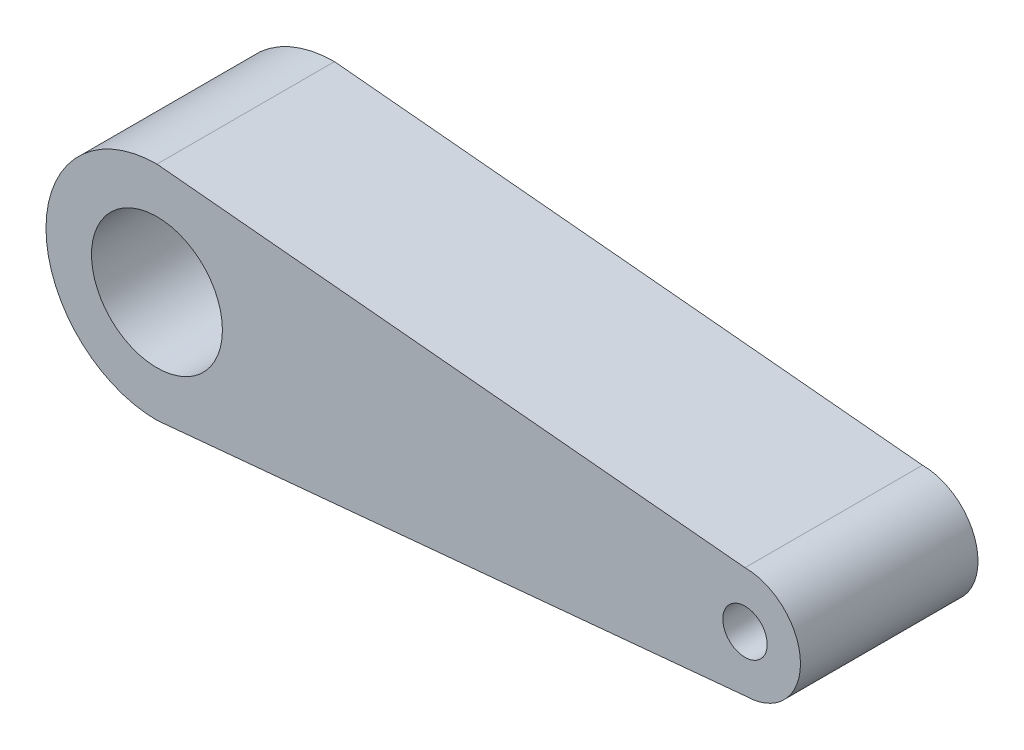
ISO-10303-21;
HEADER;
FILE_DESCRIPTION(('STEP AP214'),'2;1');
FILE_NAME('part.step','',(''),(''),'','','');
FILE_SCHEMA(('AUTOMOTIVE_DESIGN { 1 0 10303 214 1 1 1 1 }'));
ENDSEC;
DATA;
#1=APPLICATION_CONTEXT('core data for automotive mechanical design processes');
#2=APPLICATION_PROTOCOL_DEFINITION('international standard','automotive_design',2000,#1);
#3=PRODUCT_CONTEXT('',#1,'mechanical');
#4=PRODUCT('Part','Part','',(#3));
#5=PRODUCT_RELATED_PRODUCT_CATEGORY('part','',(#4));
#6=PRODUCT_DEFINITION_FORMATION('','',#4);
#7=PRODUCT_DEFINITION_CONTEXT('part definition',#1,'design');
#8=PRODUCT_DEFINITION('design','',#6,#7);
#9=PRODUCT_DEFINITION_SHAPE('','',#8);
#10=(LENGTH_UNIT() NAMED_UNIT(*) SI_UNIT(.MILLI.,.METRE.));
#11=(NAMED_UNIT(*) PLANE_ANGLE_UNIT() SI_UNIT($,.RADIAN.));
#12=(NAMED_UNIT(*) SI_UNIT($,.STERADIAN.) SOLID_ANGLE_UNIT());
#13=UNCERTAINTY_MEASURE_WITH_UNIT(LENGTH_MEASURE(1.E-05),#10,'distance_accuracy_value','');
#14=(GEOMETRIC_REPRESENTATION_CONTEXT(3) GLOBAL_UNCERTAINTY_ASSIGNED_CONTEXT((#13)) GLOBAL_UNIT_ASSIGNED_CONTEXT((#10,
#11,#12)) REPRESENTATION_CONTEXT('',''));
#15=CARTESIAN_POINT('',(0.,0.,0.));
#16=DIRECTION('',(0.,0.,1.));
#17=DIRECTION('',(1.,0.,0.));
#18=AXIS2_PLACEMENT_3D('',#15,#16,#17);
#19=CARTESIAN_POINT('',(26.5,0.,8.));
#20=DIRECTION('',(0.,0.,-1.));
#21=DIRECTION('',(-1.,0.,0.));
#22=AXIS2_PLACEMENT_3D('',#19,#20,#21);
#23=CYLINDRICAL_SURFACE('',#22,2.5);
#24=CARTESIAN_POINT('',(26.5,0.,0.));
#25=DIRECTION('',(0.,0.,1.));
#26=DIRECTION('',(1.,0.,0.));
#27=AXIS2_PLACEMENT_3D('',#24,#25,#26);
#28=CIRCLE('',#27,2.5);
#29=CARTESIAN_POINT('',(26.5,2.5,0.));
#30=VERTEX_POINT('',#29);
#31=CARTESIAN_POINT('',(26.5,-2.5,0.));
#32=VERTEX_POINT('',#31);
#33=EDGE_CURVE('E126',#30,#32,#28,.F.);
#34=ORIENTED_EDGE('',*,*,#33,.F.);
#35=DIRECTION('',(0.,0.,-1.));
#36=VECTOR('',#35,1.);
#37=CARTESIAN_POINT('',(26.5,2.5,8.));
#38=LINE('',#37,#36);
#39=CARTESIAN_POINT('',(26.5,2.5,8.));
#40=VERTEX_POINT('',#39);
#41=EDGE_CURVE('E11',#40,#30,#38,.T.);
#42=ORIENTED_EDGE('',*,*,#41,.F.);
#43=CARTESIAN_POINT('',(26.5,0.,8.));
#44=DIRECTION('',(0.,0.,1.));
#45=DIRECTION('',(1.,0.,0.));
#46=AXIS2_PLACEMENT_3D('',#43,#44,#45);
#47=CIRCLE('',#46,2.5);
#48=CARTESIAN_POINT('',(26.5,-2.5,8.));
#49=VERTEX_POINT('',#48);
#50=EDGE_CURVE('E108',#40,#49,#47,.F.);
#51=ORIENTED_EDGE('',*,*,#50,.T.);
#52=DIRECTION('',(0.,0.,-1.));
#53=VECTOR('',#52,1.);
#54=CARTESIAN_POINT('',(26.5,-2.5,8.));
#55=LINE('',#54,#53);
#56=EDGE_CURVE('E63',#49,#32,#55,.T.);
#57=ORIENTED_EDGE('',*,*,#56,.T.);
#58=EDGE_LOOP('',(#34,#42,#51,#57));
#59=FACE_BOUND('',#58,.T.);
#60=ADVANCED_FACE('F45',(#59),#23,.T.);
#61=CARTESIAN_POINT('',(0.467537050105857,4.95589273112209,8.));
#62=DIRECTION('',(0.0939225945956681,0.995579502714082,0.));
#63=DIRECTION('',(-0.995579502714081,0.0939225945956681,0.));
#64=AXIS2_PLACEMENT_3D('',#61,#62,#63);
#65=PLANE('',#64);
#66=DIRECTION('',(0.995579502714082,-0.0939225945956681,0.));
#67=VECTOR('',#66,1.);
#68=CARTESIAN_POINT('',(0.467537050105857,4.95589273112209,0.));
#69=LINE('',#68,#67);
#70=CARTESIAN_POINT('',(0.,5.,0.));
#71=VERTEX_POINT('',#70);
#72=EDGE_CURVE('E95',#71,#30,#69,.T.);
#73=ORIENTED_EDGE('',*,*,#72,.F.);
#74=DIRECTION('',(0.,0.,-1.));
#75=VECTOR('',#74,1.);
#76=CARTESIAN_POINT('',(0.,5.,8.));
#77=LINE('',#76,#75);
#78=CARTESIAN_POINT('',(0.,5.,8.));
#79=VERTEX_POINT('',#78);
#80=EDGE_CURVE('E55',#79,#71,#77,.T.);
#81=ORIENTED_EDGE('',*,*,#80,.F.);
#82=DIRECTION('',(0.995579502714082,-0.0939225945956681,0.));
#83=VECTOR('',#82,1.);
#84=CARTESIAN_POINT('',(0.467537050105857,4.95589273112209,8.));
#85=LINE('',#84,#83);
#86=EDGE_CURVE('E93',#79,#40,#85,.T.);
#87=ORIENTED_EDGE('',*,*,#86,.T.);
#88=ORIENTED_EDGE('',*,*,#41,.T.);
#89=EDGE_LOOP('',(#73,#81,#87,#88));
#90=FACE_BOUND('',#89,.T.);
#91=ADVANCED_FACE('F91',(#90),#65,.T.);
#92=CARTESIAN_POINT('',(0.,0.,8.));
#93=DIRECTION('',(0.,0.,-1.));
#94=DIRECTION('',(-1.,0.,0.));
#95=AXIS2_PLACEMENT_3D('',#92,#93,#94);
#96=CYLINDRICAL_SURFACE('',#95,5.);
#97=CARTESIAN_POINT('',(0.,0.,0.));
#98=DIRECTION('',(0.,0.,1.));
#99=DIRECTION('',(1.,0.,0.));
#100=AXIS2_PLACEMENT_3D('',#97,#98,#99);
#101=CIRCLE('',#100,5.);
#102=CARTESIAN_POINT('',(0.,-5.,0.));
#103=VERTEX_POINT('',#102);
#104=EDGE_CURVE('E131',#71,#103,#101,.T.);
#105=ORIENTED_EDGE('',*,*,#104,.T.);
#106=DIRECTION('',(0.,0.,-1.));
#107=VECTOR('',#106,1.);
#108=CARTESIAN_POINT('',(0.,-5.,8.));
#109=LINE('',#108,#107);
#110=CARTESIAN_POINT('',(0.,-5.,8.));
#111=VERTEX_POINT('',#110);
#112=EDGE_CURVE('E77',#111,#103,#109,.T.);
#113=ORIENTED_EDGE('',*,*,#112,.F.);
#114=CARTESIAN_POINT('',(0.,0.,8.));
#115=DIRECTION('',(0.,0.,1.));
#116=DIRECTION('',(1.,0.,0.));
#117=AXIS2_PLACEMENT_3D('',#114,#115,#116);
#118=CIRCLE('',#117,5.);
#119=EDGE_CURVE('E99',#79,#111,#118,.T.);
#120=ORIENTED_EDGE('',*,*,#119,.F.);
#121=ORIENTED_EDGE('',*,*,#80,.T.);
#122=EDGE_LOOP('',(#105,#113,#120,#121));
#123=FACE_BOUND('',#122,.T.);
#124=ADVANCED_FACE('F100',(#123),#96,.T.);
#125=CARTESIAN_POINT('',(0.467537050105857,-4.95589273112209,8.));
#126=DIRECTION('',(0.0939225945956681,-0.995579502714082,0.));
#127=DIRECTION('',(0.995579502714081,0.0939225945956681,0.));
#128=AXIS2_PLACEMENT_3D('',#125,#126,#127);
#129=PLANE('',#128);
#130=DIRECTION('',(-0.995579502714082,-0.0939225945956681,0.));
#131=VECTOR('',#130,1.);
#132=CARTESIAN_POINT('',(0.467537050105857,-4.95589273112209,0.));
#133=LINE('',#132,#131);
#134=EDGE_CURVE('E134',#32,#103,#133,.T.);
#135=ORIENTED_EDGE('',*,*,#134,.F.);
#136=ORIENTED_EDGE('',*,*,#56,.F.);
#137=DIRECTION('',(-0.995579502714082,-0.0939225945956681,0.));
#138=VECTOR('',#137,1.);
#139=CARTESIAN_POINT('',(0.467537050105857,-4.95589273112209,8.));
#140=LINE('',#139,#138);
#141=EDGE_CURVE('E104',#49,#111,#140,.T.);
#142=ORIENTED_EDGE('',*,*,#141,.T.);
#143=ORIENTED_EDGE('',*,*,#112,.T.);
#144=EDGE_LOOP('',(#135,#136,#142,#143));
#145=FACE_BOUND('',#144,.T.);
#146=ADVANCED_FACE('F173',(#145),#129,.T.);
#147=CARTESIAN_POINT('',(26.5,0.,8.));
#148=DIRECTION('',(0.,0.,-1.));
#149=DIRECTION('',(-1.,0.,0.));
#150=AXIS2_PLACEMENT_3D('',#147,#148,#149);
#151=CYLINDRICAL_SURFACE('',#150,1.);
#152=CARTESIAN_POINT('',(26.5,0.,8.));
#153=DIRECTION('',(0.,0.,1.));
#154=DIRECTION('',(1.,0.,0.));
#155=AXIS2_PLACEMENT_3D('',#152,#153,#154);
#156=CIRCLE('',#155,1.);
#157=CARTESIAN_POINT('',(27.5,0.,8.));
#158=VERTEX_POINT('',#157);
#159=EDGE_CURVE('E112',#158,#158,#156,.T.);
#160=ORIENTED_EDGE('',*,*,#159,.T.);
#161=EDGE_LOOP('',(#160));
#162=FACE_BOUND('',#161,.T.);
#163=CARTESIAN_POINT('',(26.5,0.,0.));
#164=DIRECTION('',(0.,0.,1.));
#165=DIRECTION('',(1.,0.,0.));
#166=AXIS2_PLACEMENT_3D('',#163,#164,#165);
#167=CIRCLE('',#166,1.);
#168=CARTESIAN_POINT('',(27.5,0.,0.));
#169=VERTEX_POINT('',#168);
#170=EDGE_CURVE('E122',#169,#169,#167,.T.);
#171=ORIENTED_EDGE('',*,*,#170,.F.);
#172=EDGE_LOOP('',(#171));
#173=FACE_BOUND('',#172,.T.);
#174=ADVANCED_FACE('F47',(#162,#173),#151,.F.);
#175=CARTESIAN_POINT('',(0.,0.,8.));
#176=DIRECTION('',(0.,0.,-1.));
#177=DIRECTION('',(-1.,0.,0.));
#178=AXIS2_PLACEMENT_3D('',#175,#176,#177);
#179=CYLINDRICAL_SURFACE('',#178,2.95);
#180=CARTESIAN_POINT('',(0.,0.,8.));
#181=DIRECTION('',(0.,0.,1.));
#182=DIRECTION('',(1.,0.,0.));
#183=AXIS2_PLACEMENT_3D('',#180,#181,#182);
#184=CIRCLE('',#183,2.95);
#185=CARTESIAN_POINT('',(2.95,0.,8.));
#186=VERTEX_POINT('',#185);
#187=EDGE_CURVE('E118',#186,#186,#184,.T.);
#188=ORIENTED_EDGE('',*,*,#187,.T.);
#189=EDGE_LOOP('',(#188));
#190=FACE_BOUND('',#189,.T.);
#191=CARTESIAN_POINT('',(0.,0.,0.));
#192=DIRECTION('',(0.,0.,1.));
#193=DIRECTION('',(1.,0.,0.));
#194=AXIS2_PLACEMENT_3D('',#191,#192,#193);
#195=CIRCLE('',#194,2.95);
#196=CARTESIAN_POINT('',(2.95,0.,0.));
#197=VERTEX_POINT('',#196);
#198=EDGE_CURVE('E138',#197,#197,#195,.T.);
#199=ORIENTED_EDGE('',*,*,#198,.F.);
#200=EDGE_LOOP('',(#199));
#201=FACE_BOUND('',#200,.T.);
#202=ADVANCED_FACE('F155',(#190,#201),#179,.F.);
#203=CARTESIAN_POINT('',(0.,0.,8.));
#204=DIRECTION('',(0.,0.,1.));
#205=DIRECTION('',(1.,0.,0.));
#206=AXIS2_PLACEMENT_3D('',#203,#204,#205);
#207=PLANE('',#206);
#208=ORIENTED_EDGE('',*,*,#159,.F.);
#209=EDGE_LOOP('',(#208));
#210=FACE_BOUND('',#209,.T.);
#211=ORIENTED_EDGE('',*,*,#50,.F.);
#212=ORIENTED_EDGE('',*,*,#86,.F.);
#213=ORIENTED_EDGE('',*,*,#119,.T.);
#214=ORIENTED_EDGE('',*,*,#141,.F.);
#215=EDGE_LOOP('',(#211,#212,#213,#214));
#216=FACE_BOUND('',#215,.T.);
#217=ORIENTED_EDGE('',*,*,#187,.F.);
#218=EDGE_LOOP('',(#217));
#219=FACE_BOUND('',#218,.T.);
#220=ADVANCED_FACE('F106',(#210,#216,#219),#207,.T.);
#221=CARTESIAN_POINT('',(0.,0.,0.));
#222=DIRECTION('',(0.,0.,1.));
#223=DIRECTION('',(1.,0.,0.));
#224=AXIS2_PLACEMENT_3D('',#221,#222,#223);
#225=PLANE('',#224);
#226=ORIENTED_EDGE('',*,*,#170,.T.);
#227=EDGE_LOOP('',(#226));
#228=FACE_BOUND('',#227,.T.);
#229=ORIENTED_EDGE('',*,*,#33,.T.);
#230=ORIENTED_EDGE('',*,*,#134,.T.);
#231=ORIENTED_EDGE('',*,*,#104,.F.);
#232=ORIENTED_EDGE('',*,*,#72,.T.);
#233=EDGE_LOOP('',(#229,#230,#231,#232));
#234=FACE_BOUND('',#233,.T.);
#235=ORIENTED_EDGE('',*,*,#198,.T.);
#236=EDGE_LOOP('',(#235));
#237=FACE_BOUND('',#236,.T.);
#238=ADVANCED_FACE('F154',(#228,#234,#237),#225,.F.);
#239=CLOSED_SHELL('',(#60,#91,#124,#146,#174,#202,#220,#238));
#240=MANIFOLD_SOLID_BREP('B2',#239);
#241=ADVANCED_BREP_SHAPE_REPRESENTATION('',(#18,#240),#14);
#242=SHAPE_DEFINITION_REPRESENTATION(#9,#241);
ENDSEC;
END-ISO-10303-21;
